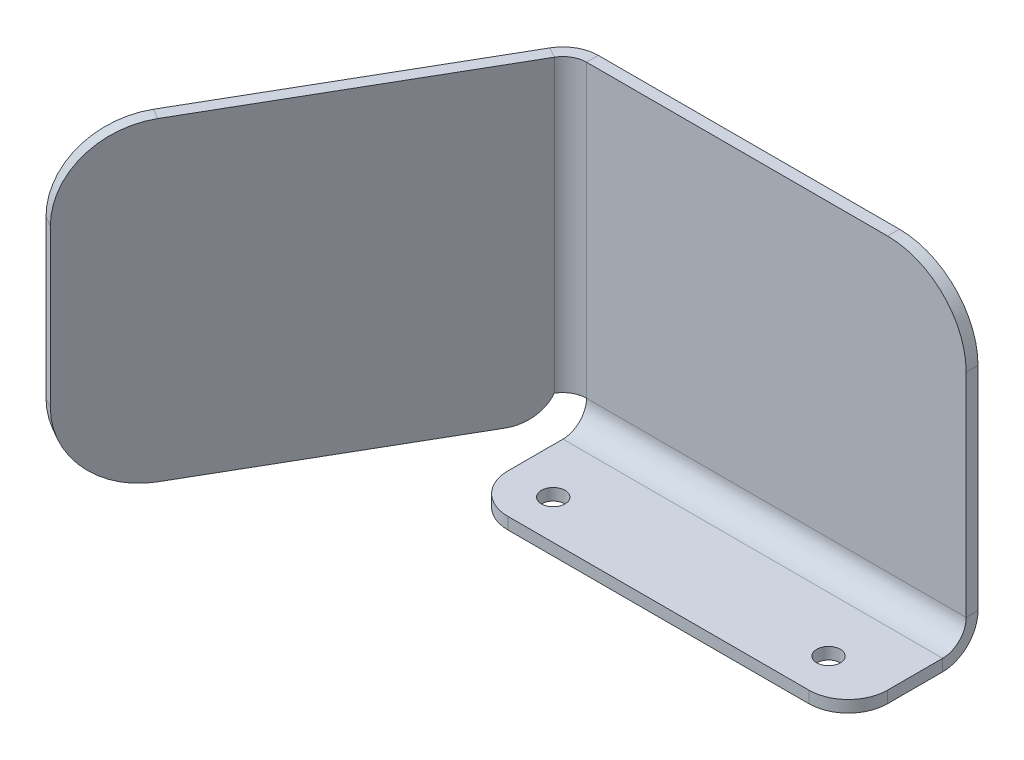
ISO-10303-21;
HEADER;
FILE_DESCRIPTION(('STEP AP214'),'2;1');
FILE_NAME('part.step','',(''),(''),'','','');
FILE_SCHEMA(('AUTOMOTIVE_DESIGN { 1 0 10303 214 1 1 1 1 }'));
ENDSEC;
DATA;
#1=APPLICATION_CONTEXT('core data for automotive mechanical design processes');
#2=APPLICATION_PROTOCOL_DEFINITION('international standard','automotive_design',2000,#1);
#3=PRODUCT_CONTEXT('',#1,'mechanical');
#4=PRODUCT('Part','Part','',(#3));
#5=PRODUCT_RELATED_PRODUCT_CATEGORY('part','',(#4));
#6=PRODUCT_DEFINITION_FORMATION('','',#4);
#7=PRODUCT_DEFINITION_CONTEXT('part definition',#1,'design');
#8=PRODUCT_DEFINITION('design','',#6,#7);
#9=PRODUCT_DEFINITION_SHAPE('','',#8);
#10=(LENGTH_UNIT() NAMED_UNIT(*) SI_UNIT(.MILLI.,.METRE.));
#11=(NAMED_UNIT(*) PLANE_ANGLE_UNIT() SI_UNIT($,.RADIAN.));
#12=(NAMED_UNIT(*) SI_UNIT($,.STERADIAN.) SOLID_ANGLE_UNIT());
#13=UNCERTAINTY_MEASURE_WITH_UNIT(LENGTH_MEASURE(1.E-05),#10,'distance_accuracy_value','');
#14=(GEOMETRIC_REPRESENTATION_CONTEXT(3) GLOBAL_UNCERTAINTY_ASSIGNED_CONTEXT((#13)) GLOBAL_UNIT_ASSIGNED_CONTEXT((#10,
#11,#12)) REPRESENTATION_CONTEXT('',''));
#15=CARTESIAN_POINT('',(0.,0.,0.));
#16=DIRECTION('',(0.,0.,1.));
#17=DIRECTION('',(1.,0.,0.));
#18=AXIS2_PLACEMENT_3D('',#15,#16,#17);
#19=CARTESIAN_POINT('',(-23.2679491924311,-20.,4.50000000000002));
#20=DIRECTION('',(0.,-1.,0.));
#21=DIRECTION('',(-0.866025403784436,0.,-0.500000000000004));
#22=AXIS2_PLACEMENT_3D('',#19,#20,#21);
#23=CYLINDRICAL_SURFACE('',#22,4.5);
#24=DIRECTION('',(0.,-1.,0.));
#25=VECTOR('',#24,1.);
#26=CARTESIAN_POINT('',(-23.2679491924311,-20.,0.));
#27=LINE('',#26,#25);
#28=CARTESIAN_POINT('',(-23.2679491924311,-17.,0.));
#29=VERTEX_POINT('',#28);
#30=CARTESIAN_POINT('',(-23.2679491924311,20.,0.));
#31=VERTEX_POINT('',#30);
#32=EDGE_CURVE('E250',#29,#31,#27,.F.);
#33=ORIENTED_EDGE('',*,*,#32,.F.);
#34=CARTESIAN_POINT('',(-23.2679491924311,-17.,4.50000000000002));
#35=DIRECTION('',(0.,-1.,0.));
#36=DIRECTION('',(0.,0.,-1.));
#37=AXIS2_PLACEMENT_3D('',#34,#35,#36);
#38=CIRCLE('',#37,4.5);
#39=CARTESIAN_POINT('',(-27.1650635094611,-17.,2.24999999999999));
#40=VERTEX_POINT('',#39);
#41=EDGE_CURVE('E277',#29,#40,#38,.F.);
#42=ORIENTED_EDGE('',*,*,#41,.T.);
#43=DIRECTION('',(0.,-1.,0.));
#44=VECTOR('',#43,1.);
#45=CARTESIAN_POINT('',(-27.1650635094611,0.,2.24999999999999));
#46=LINE('',#45,#44);
#47=CARTESIAN_POINT('',(-27.1650635094611,20.,2.24999999999998));
#48=VERTEX_POINT('',#47);
#49=EDGE_CURVE('E226',#48,#40,#46,.T.);
#50=ORIENTED_EDGE('',*,*,#49,.F.);
#51=CARTESIAN_POINT('',(-23.2679491924311,20.,4.5));
#52=DIRECTION('',(0.,-1.,0.));
#53=DIRECTION('',(0.,0.,-1.));
#54=AXIS2_PLACEMENT_3D('',#51,#52,#53);
#55=CIRCLE('',#54,4.5);
#56=EDGE_CURVE('E253',#31,#48,#55,.F.);
#57=ORIENTED_EDGE('',*,*,#56,.F.);
#58=EDGE_LOOP('',(#33,#42,#50,#57));
#59=FACE_BOUND('',#58,.T.);
#60=ADVANCED_FACE('F38',(#59),#23,.T.);
#61=CARTESIAN_POINT('',(-23.2679491924311,-17.,4.50000000000002));
#62=DIRECTION('',(0.,-1.,0.));
#63=DIRECTION('',(0.,0.,-1.));
#64=AXIS2_PLACEMENT_3D('',#61,#62,#63);
#65=PLANE('',#64);
#66=CARTESIAN_POINT('',(-23.2679491924311,-17.,4.50000000000002));
#67=DIRECTION('',(0.,-1.,0.));
#68=DIRECTION('',(0.,0.,-1.));
#69=AXIS2_PLACEMENT_3D('',#66,#67,#68);
#70=CIRCLE('',#69,3.);
#71=CARTESIAN_POINT('',(-23.2679491924311,-17.,1.50000000000002));
#72=VERTEX_POINT('',#71);
#73=CARTESIAN_POINT('',(-25.8660254037844,-17.,3.));
#74=VERTEX_POINT('',#73);
#75=EDGE_CURVE('E271',#72,#74,#70,.F.);
#76=ORIENTED_EDGE('',*,*,#75,.T.);
#77=DIRECTION('',(-0.866025403784436,0.,-0.500000000000004));
#78=VECTOR('',#77,1.);
#79=CARTESIAN_POINT('',(-25.8660254037844,-17.,3.));
#80=LINE('',#79,#78);
#81=EDGE_CURVE('E280',#74,#40,#80,.T.);
#82=ORIENTED_EDGE('',*,*,#81,.T.);
#83=ORIENTED_EDGE('',*,*,#41,.F.);
#84=DIRECTION('',(0.,0.,-1.));
#85=VECTOR('',#84,1.);
#86=CARTESIAN_POINT('',(-23.2679491924311,-17.,1.5));
#87=LINE('',#86,#85);
#88=EDGE_CURVE('E217',#72,#29,#87,.T.);
#89=ORIENTED_EDGE('',*,*,#88,.F.);
#90=EDGE_LOOP('',(#76,#82,#83,#89));
#91=FACE_BOUND('',#90,.T.);
#92=ADVANCED_FACE('F389',(#91),#65,.T.);
#93=CARTESIAN_POINT('',(0.,0.,1.5));
#94=DIRECTION('',(0.,0.,1.));
#95=DIRECTION('',(1.,0.,0.));
#96=AXIS2_PLACEMENT_3D('',#93,#94,#95);
#97=PLANE('',#96);
#98=DIRECTION('',(0.,1.,0.));
#99=VECTOR('',#98,1.);
#100=CARTESIAN_POINT('',(25.,20.,1.5));
#101=LINE('',#100,#99);
#102=CARTESIAN_POINT('',(25.,-17.,1.5));
#103=VERTEX_POINT('',#102);
#104=CARTESIAN_POINT('',(25.,9.99999999999999,1.5));
#105=VERTEX_POINT('',#104);
#106=EDGE_CURVE('E265',#103,#105,#101,.T.);
#107=ORIENTED_EDGE('',*,*,#106,.T.);
#108=CARTESIAN_POINT('',(15.,9.99999999999999,1.5));
#109=DIRECTION('',(0.,0.,1.));
#110=DIRECTION('',(1.,0.,0.));
#111=AXIS2_PLACEMENT_3D('',#108,#109,#110);
#112=CIRCLE('',#111,10.);
#113=CARTESIAN_POINT('',(15.,20.,1.5));
#114=VERTEX_POINT('',#113);
#115=EDGE_CURVE('E290',#105,#114,#112,.T.);
#116=ORIENTED_EDGE('',*,*,#115,.T.);
#117=DIRECTION('',(-1.,0.,0.));
#118=VECTOR('',#117,1.);
#119=CARTESIAN_POINT('',(-25.,20.,1.5));
#120=LINE('',#119,#118);
#121=CARTESIAN_POINT('',(-23.2679491924311,20.,1.5));
#122=VERTEX_POINT('',#121);
#123=EDGE_CURVE('E268',#114,#122,#120,.T.);
#124=ORIENTED_EDGE('',*,*,#123,.T.);
#125=DIRECTION('',(0.,-1.,0.));
#126=VECTOR('',#125,1.);
#127=CARTESIAN_POINT('',(-23.2679491924311,-20.,1.50000000000002));
#128=LINE('',#127,#126);
#129=EDGE_CURVE('E242',#72,#122,#128,.F.);
#130=ORIENTED_EDGE('',*,*,#129,.F.);
#131=DIRECTION('',(1.,0.,0.));
#132=VECTOR('',#131,1.);
#133=CARTESIAN_POINT('',(25.,-17.,1.5));
#134=LINE('',#133,#132);
#135=EDGE_CURVE('E213',#103,#72,#134,.F.);
#136=ORIENTED_EDGE('',*,*,#135,.F.);
#137=EDGE_LOOP('',(#107,#116,#124,#130,#136));
#138=FACE_BOUND('',#137,.T.);
#139=ADVANCED_FACE('F395',(#138),#97,.T.);
#140=CARTESIAN_POINT('',(0.,0.,0.));
#141=DIRECTION('',(0.,0.,1.));
#142=DIRECTION('',(1.,0.,0.));
#143=AXIS2_PLACEMENT_3D('',#140,#141,#142);
#144=PLANE('',#143);
#145=DIRECTION('',(-1.,0.,0.));
#146=VECTOR('',#145,1.);
#147=CARTESIAN_POINT('',(-25.,20.,0.));
#148=LINE('',#147,#146);
#149=CARTESIAN_POINT('',(15.,20.,0.));
#150=VERTEX_POINT('',#149);
#151=EDGE_CURVE('E269',#150,#31,#148,.T.);
#152=ORIENTED_EDGE('',*,*,#151,.F.);
#153=CARTESIAN_POINT('',(15.,9.99999999999999,0.));
#154=DIRECTION('',(0.,0.,1.));
#155=DIRECTION('',(1.,0.,0.));
#156=AXIS2_PLACEMENT_3D('',#153,#154,#155);
#157=CIRCLE('',#156,10.);
#158=CARTESIAN_POINT('',(25.,9.99999999999999,0.));
#159=VERTEX_POINT('',#158);
#160=EDGE_CURVE('E286',#150,#159,#157,.F.);
#161=ORIENTED_EDGE('',*,*,#160,.T.);
#162=DIRECTION('',(0.,1.,0.));
#163=VECTOR('',#162,1.);
#164=CARTESIAN_POINT('',(25.,20.,0.));
#165=LINE('',#164,#163);
#166=CARTESIAN_POINT('',(25.,-17.,0.));
#167=VERTEX_POINT('',#166);
#168=EDGE_CURVE('E264',#167,#159,#165,.T.);
#169=ORIENTED_EDGE('',*,*,#168,.F.);
#170=DIRECTION('',(1.,0.,0.));
#171=VECTOR('',#170,1.);
#172=CARTESIAN_POINT('',(25.,-17.,0.));
#173=LINE('',#172,#171);
#174=EDGE_CURVE('E179',#167,#29,#173,.F.);
#175=ORIENTED_EDGE('',*,*,#174,.T.);
#176=ORIENTED_EDGE('',*,*,#32,.T.);
#177=EDGE_LOOP('',(#152,#161,#169,#175,#176));
#178=FACE_BOUND('',#177,.T.);
#179=ADVANCED_FACE('F415',(#178),#144,.F.);
#180=CARTESIAN_POINT('',(25.,20.,1.5));
#181=DIRECTION('',(-1.,0.,0.));
#182=DIRECTION('',(0.,-1.,0.));
#183=AXIS2_PLACEMENT_3D('',#180,#181,#182);
#184=PLANE('',#183);
#185=ORIENTED_EDGE('',*,*,#168,.T.);
#186=DIRECTION('',(0.,0.,-1.));
#187=VECTOR('',#186,1.);
#188=CARTESIAN_POINT('',(25.,9.99999999999999,1.5));
#189=LINE('',#188,#187);
#190=EDGE_CURVE('E288',#159,#105,#189,.F.);
#191=ORIENTED_EDGE('',*,*,#190,.T.);
#192=ORIENTED_EDGE('',*,*,#106,.F.);
#193=DIRECTION('',(0.,0.,-1.));
#194=VECTOR('',#193,1.);
#195=CARTESIAN_POINT('',(25.,-17.,1.5));
#196=LINE('',#195,#194);
#197=EDGE_CURVE('E209',#103,#167,#196,.T.);
#198=ORIENTED_EDGE('',*,*,#197,.T.);
#199=EDGE_LOOP('',(#185,#191,#192,#198));
#200=FACE_BOUND('',#199,.T.);
#201=ADVANCED_FACE('F419',(#200),#184,.F.);
#202=CARTESIAN_POINT('',(-25.,20.,1.5));
#203=DIRECTION('',(0.,-1.,0.));
#204=DIRECTION('',(0.,0.,-1.));
#205=AXIS2_PLACEMENT_3D('',#202,#203,#204);
#206=PLANE('',#205);
#207=ORIENTED_EDGE('',*,*,#123,.F.);
#208=DIRECTION('',(0.,0.,-1.));
#209=VECTOR('',#208,1.);
#210=CARTESIAN_POINT('',(15.,20.,1.5));
#211=LINE('',#210,#209);
#212=EDGE_CURVE('E283',#114,#150,#211,.T.);
#213=ORIENTED_EDGE('',*,*,#212,.T.);
#214=ORIENTED_EDGE('',*,*,#151,.T.);
#215=DIRECTION('',(0.,0.,-1.));
#216=VECTOR('',#215,1.);
#217=CARTESIAN_POINT('',(-23.2679491924311,20.,1.5));
#218=LINE('',#217,#216);
#219=EDGE_CURVE('E257',#122,#31,#218,.T.);
#220=ORIENTED_EDGE('',*,*,#219,.F.);
#221=EDGE_LOOP('',(#207,#213,#214,#220));
#222=FACE_BOUND('',#221,.T.);
#223=ADVANCED_FACE('F411',(#222),#206,.F.);
#224=CARTESIAN_POINT('',(-23.2679491924311,20.,4.5));
#225=DIRECTION('',(0.,1.,0.));
#226=DIRECTION('',(0.,0.,1.));
#227=AXIS2_PLACEMENT_3D('',#224,#225,#226);
#228=PLANE('',#227);
#229=DIRECTION('',(-0.866025403784436,0.,-0.500000000000004));
#230=VECTOR('',#229,1.);
#231=CARTESIAN_POINT('',(-25.8660254037844,20.,2.99999999999999));
#232=LINE('',#231,#230);
#233=CARTESIAN_POINT('',(-25.8660254037844,20.,2.99999999999998));
#234=VERTEX_POINT('',#233);
#235=EDGE_CURVE('E220',#234,#48,#232,.T.);
#236=ORIENTED_EDGE('',*,*,#235,.F.);
#237=CARTESIAN_POINT('',(-23.2679491924311,20.,4.5));
#238=DIRECTION('',(0.,-1.,0.));
#239=DIRECTION('',(0.,0.,-1.));
#240=AXIS2_PLACEMENT_3D('',#237,#238,#239);
#241=CIRCLE('',#240,3.);
#242=EDGE_CURVE('E254',#122,#234,#241,.F.);
#243=ORIENTED_EDGE('',*,*,#242,.F.);
#244=ORIENTED_EDGE('',*,*,#219,.T.);
#245=ORIENTED_EDGE('',*,*,#56,.T.);
#246=EDGE_LOOP('',(#236,#243,#244,#245));
#247=FACE_BOUND('',#246,.T.);
#248=ADVANCED_FACE('F407',(#247),#228,.T.);
#249=CARTESIAN_POINT('',(-23.2679491924311,-20.,4.50000000000002));
#250=DIRECTION('',(0.,-1.,0.));
#251=DIRECTION('',(-0.866025403784436,0.,-0.500000000000004));
#252=AXIS2_PLACEMENT_3D('',#249,#250,#251);
#253=CYLINDRICAL_SURFACE('',#252,3.);
#254=ORIENTED_EDGE('',*,*,#75,.F.);
#255=ORIENTED_EDGE('',*,*,#129,.T.);
#256=ORIENTED_EDGE('',*,*,#242,.T.);
#257=DIRECTION('',(0.,-1.,0.));
#258=VECTOR('',#257,1.);
#259=CARTESIAN_POINT('',(-25.8660254037844,20.,2.99999999999999));
#260=LINE('',#259,#258);
#261=EDGE_CURVE('E223',#234,#74,#260,.T.);
#262=ORIENTED_EDGE('',*,*,#261,.T.);
#263=EDGE_LOOP('',(#254,#255,#256,#262));
#264=FACE_BOUND('',#263,.T.);
#265=ADVANCED_FACE('F403',(#264),#253,.F.);
#266=CARTESIAN_POINT('',(-26.2990381056766,-20.,0.749999999999995));
#267=DIRECTION('',(0.,-1.,0.));
#268=DIRECTION('',(1.,0.,0.));
#269=AXIS2_PLACEMENT_3D('',#266,#267,#268);
#270=PLANE('',#269);
#271=DIRECTION('',(0.500000000000004,0.,-0.866025403784436));
#272=VECTOR('',#271,1.);
#273=CARTESIAN_POINT('',(-26.2990381056766,-20.,0.749999999999995));
#274=LINE('',#273,#272);
#275=CARTESIAN_POINT('',(-45.6160254037846,-20.,34.2080034494852));
#276=VERTEX_POINT('',#275);
#277=CARTESIAN_POINT('',(-29.456351356939,-20.,6.21862696659684));
#278=VERTEX_POINT('',#277);
#279=EDGE_CURVE('E239',#276,#278,#274,.T.);
#280=ORIENTED_EDGE('',*,*,#279,.T.);
#281=DIRECTION('',(-0.866025403784436,0.,-0.500000000000004));
#282=VECTOR('',#281,1.);
#283=CARTESIAN_POINT('',(-28.1573132512623,-20.,6.96862696659686));
#284=LINE('',#283,#282);
#285=CARTESIAN_POINT('',(-28.1573132512624,-20.,6.96862696659685));
#286=VERTEX_POINT('',#285);
#287=EDGE_CURVE('E312',#278,#286,#284,.F.);
#288=ORIENTED_EDGE('',*,*,#287,.T.);
#289=DIRECTION('',(0.500000000000004,0.,-0.866025403784436));
#290=VECTOR('',#289,1.);
#291=CARTESIAN_POINT('',(-25.,-20.,1.5));
#292=LINE('',#291,#290);
#293=CARTESIAN_POINT('',(-44.3169872981079,-20.,34.9580034494852));
#294=VERTEX_POINT('',#293);
#295=EDGE_CURVE('E236',#294,#286,#292,.T.);
#296=ORIENTED_EDGE('',*,*,#295,.F.);
#297=DIRECTION('',(0.866025403784436,0.,0.500000000000004));
#298=VECTOR('',#297,1.);
#299=CARTESIAN_POINT('',(-45.6160254037846,-20.,34.2080034494852));
#300=LINE('',#299,#298);
#301=EDGE_CURVE('E301',#294,#276,#300,.F.);
#302=ORIENTED_EDGE('',*,*,#301,.T.);
#303=EDGE_LOOP('',(#280,#288,#296,#302));
#304=FACE_BOUND('',#303,.T.);
#305=ADVANCED_FACE('F406',(#304),#270,.T.);
#306=CARTESIAN_POINT('',(-50.6160254037846,20.,42.8682574873296));
#307=DIRECTION('',(0.,1.,0.));
#308=DIRECTION('',(-1.,0.,0.));
#309=AXIS2_PLACEMENT_3D('',#306,#307,#308);
#310=PLANE('',#309);
#311=DIRECTION('',(-0.500000000000004,0.,0.866025403784436));
#312=VECTOR('',#311,1.);
#313=CARTESIAN_POINT('',(-50.6160254037846,20.,42.8682574873296));
#314=LINE('',#313,#312);
#315=CARTESIAN_POINT('',(-45.6160254037846,20.,34.2080034494852));
#316=VERTEX_POINT('',#315);
#317=EDGE_CURVE('E232',#48,#316,#314,.T.);
#318=ORIENTED_EDGE('',*,*,#317,.T.);
#319=DIRECTION('',(0.866025403784436,0.,0.500000000000004));
#320=VECTOR('',#319,1.);
#321=CARTESIAN_POINT('',(-45.6160254037846,20.,34.2080034494852));
#322=LINE('',#321,#320);
#323=CARTESIAN_POINT('',(-44.3169872981079,20.,34.9580034494852));
#324=VERTEX_POINT('',#323);
#325=EDGE_CURVE('E307',#316,#324,#322,.T.);
#326=ORIENTED_EDGE('',*,*,#325,.T.);
#327=DIRECTION('',(-0.500000000000004,0.,0.866025403784436));
#328=VECTOR('',#327,1.);
#329=CARTESIAN_POINT('',(-49.316987298108,20.,43.6182574873296));
#330=LINE('',#329,#328);
#331=EDGE_CURVE('E231',#234,#324,#330,.T.);
#332=ORIENTED_EDGE('',*,*,#331,.F.);
#333=ORIENTED_EDGE('',*,*,#235,.T.);
#334=EDGE_LOOP('',(#318,#326,#332,#333));
#335=FACE_BOUND('',#334,.T.);
#336=ADVANCED_FACE('F401',(#335),#310,.T.);
#337=CARTESIAN_POINT('',(-19.3995190528382,0.,-11.2003175473055));
#338=DIRECTION('',(-0.866025403784436,0.,-0.500000000000004));
#339=DIRECTION('',(-0.500000000000004,0.,0.866025403784436));
#340=AXIS2_PLACEMENT_3D('',#337,#338,#339);
#341=PLANE('',#340);
#342=ORIENTED_EDGE('',*,*,#49,.T.);
#343=CARTESIAN_POINT('',(-29.456351356939,-14.9999999999999,6.21862696659684));
#344=DIRECTION('',(-0.866025403784436,0.,-0.500000000000004));
#345=DIRECTION('',(-0.500000000000004,0.,0.866025403784436));
#346=AXIS2_PLACEMENT_3D('',#343,#344,#345);
#347=CIRCLE('',#346,5.);
#348=EDGE_CURVE('E310',#40,#278,#347,.T.);
#349=ORIENTED_EDGE('',*,*,#348,.T.);
#350=ORIENTED_EDGE('',*,*,#279,.F.);
#351=CARTESIAN_POINT('',(-45.6160254037846,-10.,34.2080034494852));
#352=DIRECTION('',(-0.866025403784436,0.,-0.500000000000004));
#353=DIRECTION('',(-0.500000000000004,0.,0.866025403784436));
#354=AXIS2_PLACEMENT_3D('',#351,#352,#353);
#355=CIRCLE('',#354,10.);
#356=CARTESIAN_POINT('',(-50.6160254037846,-10.,42.8682574873296));
#357=VERTEX_POINT('',#356);
#358=EDGE_CURVE('E305',#276,#357,#355,.T.);
#359=ORIENTED_EDGE('',*,*,#358,.T.);
#360=DIRECTION('',(0.,-1.,0.));
#361=VECTOR('',#360,1.);
#362=CARTESIAN_POINT('',(-50.6160254037846,-20.,42.8682574873296));
#363=LINE('',#362,#361);
#364=CARTESIAN_POINT('',(-50.6160254037846,9.99999999999998,42.8682574873296));
#365=VERTEX_POINT('',#364);
#366=EDGE_CURVE('E235',#365,#357,#363,.T.);
#367=ORIENTED_EDGE('',*,*,#366,.F.);
#368=CARTESIAN_POINT('',(-45.6160254037846,9.99999999999998,34.2080034494852));
#369=DIRECTION('',(-0.866025403784436,0.,-0.500000000000004));
#370=DIRECTION('',(-0.500000000000004,0.,0.866025403784436));
#371=AXIS2_PLACEMENT_3D('',#368,#369,#370);
#372=CIRCLE('',#371,10.);
#373=EDGE_CURVE('E303',#365,#316,#372,.T.);
#374=ORIENTED_EDGE('',*,*,#373,.T.);
#375=ORIENTED_EDGE('',*,*,#317,.F.);
#376=EDGE_LOOP('',(#342,#349,#350,#359,#367,#374,#375));
#377=FACE_BOUND('',#376,.T.);
#378=ADVANCED_FACE('F512',(#377),#341,.T.);
#379=CARTESIAN_POINT('',(-18.1004809471616,0.,-10.4503175473055));
#380=DIRECTION('',(-0.866025403784436,0.,-0.500000000000004));
#381=DIRECTION('',(-0.500000000000004,0.,0.866025403784436));
#382=AXIS2_PLACEMENT_3D('',#379,#380,#381);
#383=PLANE('',#382);
#384=ORIENTED_EDGE('',*,*,#295,.T.);
#385=CARTESIAN_POINT('',(-28.1573132512624,-14.9999999999999,6.96862696659685));
#386=DIRECTION('',(-0.866025403784436,0.,-0.500000000000004));
#387=DIRECTION('',(-0.500000000000004,0.,0.866025403784436));
#388=AXIS2_PLACEMENT_3D('',#385,#386,#387);
#389=CIRCLE('',#388,5.);
#390=EDGE_CURVE('E314',#286,#74,#389,.F.);
#391=ORIENTED_EDGE('',*,*,#390,.T.);
#392=ORIENTED_EDGE('',*,*,#261,.F.);
#393=ORIENTED_EDGE('',*,*,#331,.T.);
#394=CARTESIAN_POINT('',(-44.3169872981079,9.99999999999998,34.9580034494852));
#395=DIRECTION('',(-0.866025403784436,0.,-0.500000000000004));
#396=DIRECTION('',(-0.500000000000004,0.,0.866025403784436));
#397=AXIS2_PLACEMENT_3D('',#394,#395,#396);
#398=CIRCLE('',#397,10.);
#399=CARTESIAN_POINT('',(-49.316987298108,9.99999999999998,43.6182574873296));
#400=VERTEX_POINT('',#399);
#401=EDGE_CURVE('E297',#324,#400,#398,.F.);
#402=ORIENTED_EDGE('',*,*,#401,.T.);
#403=DIRECTION('',(0.,-1.,0.));
#404=VECTOR('',#403,1.);
#405=CARTESIAN_POINT('',(-49.316987298108,-20.,43.6182574873296));
#406=LINE('',#405,#404);
#407=CARTESIAN_POINT('',(-49.316987298108,-10.,43.6182574873296));
#408=VERTEX_POINT('',#407);
#409=EDGE_CURVE('E245',#400,#408,#406,.T.);
#410=ORIENTED_EDGE('',*,*,#409,.T.);
#411=CARTESIAN_POINT('',(-44.3169872981079,-10.,34.9580034494852));
#412=DIRECTION('',(-0.866025403784436,0.,-0.500000000000004));
#413=DIRECTION('',(-0.500000000000004,0.,0.866025403784436));
#414=AXIS2_PLACEMENT_3D('',#411,#412,#413);
#415=CIRCLE('',#414,10.);
#416=EDGE_CURVE('E299',#408,#294,#415,.F.);
#417=ORIENTED_EDGE('',*,*,#416,.T.);
#418=EDGE_LOOP('',(#384,#391,#392,#393,#402,#410,#417));
#419=FACE_BOUND('',#418,.T.);
#420=ADVANCED_FACE('F506',(#419),#383,.F.);
#421=CARTESIAN_POINT('',(-50.6160254037846,-20.,42.8682574873296));
#422=DIRECTION('',(-0.500000000000004,0.,0.866025403784436));
#423=DIRECTION('',(0.866025403784436,0.,0.500000000000004));
#424=AXIS2_PLACEMENT_3D('',#421,#422,#423);
#425=PLANE('',#424);
#426=ORIENTED_EDGE('',*,*,#366,.T.);
#427=DIRECTION('',(0.866025403784436,0.,0.500000000000004));
#428=VECTOR('',#427,1.);
#429=CARTESIAN_POINT('',(-50.6160254037846,-10.,42.8682574873296));
#430=LINE('',#429,#428);
#431=EDGE_CURVE('E294',#357,#408,#430,.T.);
#432=ORIENTED_EDGE('',*,*,#431,.T.);
#433=ORIENTED_EDGE('',*,*,#409,.F.);
#434=DIRECTION('',(0.866025403784436,0.,0.500000000000004));
#435=VECTOR('',#434,1.);
#436=CARTESIAN_POINT('',(-50.6160254037846,9.99999999999998,42.8682574873296));
#437=LINE('',#436,#435);
#438=EDGE_CURVE('E292',#400,#365,#437,.F.);
#439=ORIENTED_EDGE('',*,*,#438,.T.);
#440=EDGE_LOOP('',(#426,#432,#433,#439));
#441=FACE_BOUND('',#440,.T.);
#442=ADVANCED_FACE('F511',(#441),#425,.T.);
#443=CARTESIAN_POINT('',(-23.2679491924311,-17.,4.5));
#444=DIRECTION('',(-1.,0.,0.));
#445=DIRECTION('',(0.,0.,1.));
#446=AXIS2_PLACEMENT_3D('',#443,#444,#445);
#447=PLANE('',#446);
#448=DIRECTION('',(0.,-1.,0.));
#449=VECTOR('',#448,1.);
#450=CARTESIAN_POINT('',(-23.2679491924311,-20.,4.49999999999999));
#451=LINE('',#450,#449);
#452=CARTESIAN_POINT('',(-23.2679491924311,-20.,4.49999999999999));
#453=VERTEX_POINT('',#452);
#454=CARTESIAN_POINT('',(-23.2679491924311,-21.5,4.49999999999998));
#455=VERTEX_POINT('',#454);
#456=EDGE_CURVE('E200',#453,#455,#451,.T.);
#457=ORIENTED_EDGE('',*,*,#456,.F.);
#458=CARTESIAN_POINT('',(-23.2679491924311,-17.,4.5));
#459=DIRECTION('',(1.,0.,0.));
#460=DIRECTION('',(0.,0.,-1.));
#461=AXIS2_PLACEMENT_3D('',#458,#459,#460);
#462=CIRCLE('',#461,3.);
#463=EDGE_CURVE('E182',#72,#453,#462,.F.);
#464=ORIENTED_EDGE('',*,*,#463,.F.);
#465=ORIENTED_EDGE('',*,*,#88,.T.);
#466=CARTESIAN_POINT('',(-23.2679491924311,-17.,4.5));
#467=DIRECTION('',(1.,0.,0.));
#468=DIRECTION('',(0.,0.,-1.));
#469=AXIS2_PLACEMENT_3D('',#466,#467,#468);
#470=CIRCLE('',#469,4.5);
#471=EDGE_CURVE('E208',#29,#455,#470,.F.);
#472=ORIENTED_EDGE('',*,*,#471,.T.);
#473=EDGE_LOOP('',(#457,#464,#465,#472));
#474=FACE_BOUND('',#473,.T.);
#475=ADVANCED_FACE('F583',(#474),#447,.T.);
#476=CARTESIAN_POINT('',(25.,-17.,4.5));
#477=DIRECTION('',(-1.,0.,0.));
#478=DIRECTION('',(0.,0.,1.));
#479=AXIS2_PLACEMENT_3D('',#476,#477,#478);
#480=PLANE('',#479);
#481=CARTESIAN_POINT('',(25.,-17.,4.5));
#482=DIRECTION('',(1.,0.,0.));
#483=DIRECTION('',(0.,0.,-1.));
#484=AXIS2_PLACEMENT_3D('',#481,#482,#483);
#485=CIRCLE('',#484,3.);
#486=CARTESIAN_POINT('',(25.,-20.,4.49999999999999));
#487=VERTEX_POINT('',#486);
#488=EDGE_CURVE('E167',#487,#103,#485,.T.);
#489=ORIENTED_EDGE('',*,*,#488,.F.);
#490=DIRECTION('',(0.,-1.,0.));
#491=VECTOR('',#490,1.);
#492=CARTESIAN_POINT('',(25.,-20.,4.49999999999999));
#493=LINE('',#492,#491);
#494=CARTESIAN_POINT('',(25.,-21.5,4.49999999999998));
#495=VERTEX_POINT('',#494);
#496=EDGE_CURVE('E165',#487,#495,#493,.T.);
#497=ORIENTED_EDGE('',*,*,#496,.T.);
#498=CARTESIAN_POINT('',(25.,-17.,4.5));
#499=DIRECTION('',(1.,0.,0.));
#500=DIRECTION('',(0.,0.,-1.));
#501=AXIS2_PLACEMENT_3D('',#498,#499,#500);
#502=CIRCLE('',#501,4.5);
#503=EDGE_CURVE('E173',#495,#167,#502,.T.);
#504=ORIENTED_EDGE('',*,*,#503,.T.);
#505=ORIENTED_EDGE('',*,*,#197,.F.);
#506=EDGE_LOOP('',(#489,#497,#504,#505));
#507=FACE_BOUND('',#506,.T.);
#508=ADVANCED_FACE('F185',(#507),#480,.F.);
#509=CARTESIAN_POINT('',(25.,-17.,4.5));
#510=DIRECTION('',(1.,0.,0.));
#511=DIRECTION('',(0.,-1.,0.));
#512=AXIS2_PLACEMENT_3D('',#509,#510,#511);
#513=CYLINDRICAL_SURFACE('',#512,4.5);
#514=ORIENTED_EDGE('',*,*,#174,.F.);
#515=ORIENTED_EDGE('',*,*,#503,.F.);
#516=DIRECTION('',(1.,0.,0.));
#517=VECTOR('',#516,1.);
#518=CARTESIAN_POINT('',(0.,-21.5,4.49999999999998));
#519=LINE('',#518,#517);
#520=EDGE_CURVE('E176',#455,#495,#519,.T.);
#521=ORIENTED_EDGE('',*,*,#520,.F.);
#522=ORIENTED_EDGE('',*,*,#471,.F.);
#523=EDGE_LOOP('',(#514,#515,#521,#522));
#524=FACE_BOUND('',#523,.T.);
#525=ADVANCED_FACE('F174',(#524),#513,.T.);
#526=CARTESIAN_POINT('',(25.,-17.,4.5));
#527=DIRECTION('',(1.,0.,0.));
#528=DIRECTION('',(0.,-1.,0.));
#529=AXIS2_PLACEMENT_3D('',#526,#527,#528);
#530=CYLINDRICAL_SURFACE('',#529,3.);
#531=ORIENTED_EDGE('',*,*,#135,.T.);
#532=ORIENTED_EDGE('',*,*,#463,.T.);
#533=DIRECTION('',(1.,0.,0.));
#534=VECTOR('',#533,1.);
#535=CARTESIAN_POINT('',(-23.2679491924311,-20.,4.49999999999999));
#536=LINE('',#535,#534);
#537=EDGE_CURVE('E187',#453,#487,#536,.T.);
#538=ORIENTED_EDGE('',*,*,#537,.T.);
#539=ORIENTED_EDGE('',*,*,#488,.T.);
#540=EDGE_LOOP('',(#531,#532,#538,#539));
#541=FACE_BOUND('',#540,.T.);
#542=ADVANCED_FACE('F347',(#541),#530,.F.);
#543=CARTESIAN_POINT('',(25.,-21.5,1.49999999999999));
#544=DIRECTION('',(1.,0.,0.));
#545=DIRECTION('',(0.,0.,-1.));
#546=AXIS2_PLACEMENT_3D('',#543,#544,#545);
#547=PLANE('',#546);
#548=DIRECTION('',(0.,0.,-1.));
#549=VECTOR('',#548,1.);
#550=CARTESIAN_POINT('',(25.,-20.,1.5));
#551=LINE('',#550,#549);
#552=CARTESIAN_POINT('',(25.,-20.,11.5));
#553=VERTEX_POINT('',#552);
#554=EDGE_CURVE('E202',#553,#487,#551,.T.);
#555=ORIENTED_EDGE('',*,*,#554,.F.);
#556=DIRECTION('',(0.,1.,0.));
#557=VECTOR('',#556,1.);
#558=CARTESIAN_POINT('',(25.,-21.5,11.5));
#559=LINE('',#558,#557);
#560=CARTESIAN_POINT('',(25.,-21.5,11.5));
#561=VERTEX_POINT('',#560);
#562=EDGE_CURVE('E12',#553,#561,#559,.F.);
#563=ORIENTED_EDGE('',*,*,#562,.T.);
#564=DIRECTION('',(0.,0.,-1.));
#565=VECTOR('',#564,1.);
#566=CARTESIAN_POINT('',(25.,-21.5,1.49999999999999));
#567=LINE('',#566,#565);
#568=EDGE_CURVE('E161',#561,#495,#567,.T.);
#569=ORIENTED_EDGE('',*,*,#568,.T.);
#570=ORIENTED_EDGE('',*,*,#496,.F.);
#571=EDGE_LOOP('',(#555,#563,#569,#570));
#572=FACE_BOUND('',#571,.T.);
#573=ADVANCED_FACE('F163',(#572),#547,.T.);
#574=CARTESIAN_POINT('',(-23.2679491924311,-21.5000000000001,16.5));
#575=DIRECTION('',(-1.,0.,0.));
#576=DIRECTION('',(0.,0.,1.));
#577=AXIS2_PLACEMENT_3D('',#574,#575,#576);
#578=PLANE('',#577);
#579=DIRECTION('',(0.,0.,1.));
#580=VECTOR('',#579,1.);
#581=CARTESIAN_POINT('',(-23.2679491924311,-21.5000000000001,16.5));
#582=LINE('',#581,#580);
#583=CARTESIAN_POINT('',(-23.2679491924311,-21.5,11.5));
#584=VERTEX_POINT('',#583);
#585=EDGE_CURVE('E192',#455,#584,#582,.T.);
#586=ORIENTED_EDGE('',*,*,#585,.T.);
#587=DIRECTION('',(0.,1.,0.));
#588=VECTOR('',#587,1.);
#589=CARTESIAN_POINT('',(-23.2679491924311,-21.5,11.5));
#590=LINE('',#589,#588);
#591=CARTESIAN_POINT('',(-23.2679491924311,-20.,11.5));
#592=VERTEX_POINT('',#591);
#593=EDGE_CURVE('E316',#584,#592,#590,.T.);
#594=ORIENTED_EDGE('',*,*,#593,.T.);
#595=DIRECTION('',(0.,0.,1.));
#596=VECTOR('',#595,1.);
#597=CARTESIAN_POINT('',(-23.2679491924311,-20.0000000000001,16.5));
#598=LINE('',#597,#596);
#599=EDGE_CURVE('E193',#453,#592,#598,.T.);
#600=ORIENTED_EDGE('',*,*,#599,.F.);
#601=ORIENTED_EDGE('',*,*,#456,.T.);
#602=EDGE_LOOP('',(#586,#594,#600,#601));
#603=FACE_BOUND('',#602,.T.);
#604=ADVANCED_FACE('F334',(#603),#578,.T.);
#605=CARTESIAN_POINT('',(0.,-21.5,0.));
#606=DIRECTION('',(0.,-1.,0.));
#607=DIRECTION('',(0.,0.,-1.));
#608=AXIS2_PLACEMENT_3D('',#605,#606,#607);
#609=PLANE('',#608);
#610=CARTESIAN_POINT('',(-17.5,-21.5,11.5));
#611=DIRECTION('',(0.,1.,0.));
#612=DIRECTION('',(0.,0.,1.));
#613=AXIS2_PLACEMENT_3D('',#610,#611,#612);
#614=CIRCLE('',#613,1.5);
#615=CARTESIAN_POINT('',(-17.5,-21.5,13.));
#616=VERTEX_POINT('',#615);
#617=EDGE_CURVE('E350',#616,#616,#614,.T.);
#618=ORIENTED_EDGE('',*,*,#617,.T.);
#619=EDGE_LOOP('',(#618));
#620=FACE_BOUND('',#619,.T.);
#621=CARTESIAN_POINT('',(17.5,-21.5,11.5));
#622=DIRECTION('',(0.,1.,0.));
#623=DIRECTION('',(0.,0.,1.));
#624=AXIS2_PLACEMENT_3D('',#621,#622,#623);
#625=CIRCLE('',#624,1.5);
#626=CARTESIAN_POINT('',(17.5,-21.5,13.));
#627=VERTEX_POINT('',#626);
#628=EDGE_CURVE('E355',#627,#627,#625,.T.);
#629=ORIENTED_EDGE('',*,*,#628,.T.);
#630=EDGE_LOOP('',(#629));
#631=FACE_BOUND('',#630,.T.);
#632=DIRECTION('',(1.,0.,0.));
#633=VECTOR('',#632,1.);
#634=CARTESIAN_POINT('',(25.,-21.5000000000001,16.5));
#635=LINE('',#634,#633);
#636=CARTESIAN_POINT('',(-18.2679491924311,-21.5000000000001,16.5));
#637=VERTEX_POINT('',#636);
#638=CARTESIAN_POINT('',(20.,-21.5000000000001,16.5));
#639=VERTEX_POINT('',#638);
#640=EDGE_CURVE('E168',#637,#639,#635,.T.);
#641=ORIENTED_EDGE('',*,*,#640,.F.);
#642=CARTESIAN_POINT('',(-18.2679491924311,-21.5,11.5));
#643=DIRECTION('',(0.,-1.,0.));
#644=DIRECTION('',(0.,0.,-1.));
#645=AXIS2_PLACEMENT_3D('',#642,#643,#644);
#646=CIRCLE('',#645,5.);
#647=EDGE_CURVE('E46',#637,#584,#646,.T.);
#648=ORIENTED_EDGE('',*,*,#647,.T.);
#649=ORIENTED_EDGE('',*,*,#585,.F.);
#650=ORIENTED_EDGE('',*,*,#520,.T.);
#651=ORIENTED_EDGE('',*,*,#568,.F.);
#652=CARTESIAN_POINT('',(20.,-21.5,11.5));
#653=DIRECTION('',(0.,-1.,0.));
#654=DIRECTION('',(0.,0.,-1.));
#655=AXIS2_PLACEMENT_3D('',#652,#653,#654);
#656=CIRCLE('',#655,5.);
#657=EDGE_CURVE('E58',#561,#639,#656,.T.);
#658=ORIENTED_EDGE('',*,*,#657,.T.);
#659=EDGE_LOOP('',(#641,#648,#649,#650,#651,#658));
#660=FACE_BOUND('',#659,.T.);
#661=ADVANCED_FACE('F190',(#620,#631,#660),#609,.T.);
#662=CARTESIAN_POINT('',(0.,-20.,0.));
#663=DIRECTION('',(0.,-1.,0.));
#664=DIRECTION('',(0.,0.,-1.));
#665=AXIS2_PLACEMENT_3D('',#662,#663,#664);
#666=PLANE('',#665);
#667=CARTESIAN_POINT('',(-17.5,-20.,11.5));
#668=DIRECTION('',(0.,1.,0.));
#669=DIRECTION('',(0.,0.,1.));
#670=AXIS2_PLACEMENT_3D('',#667,#668,#669);
#671=CIRCLE('',#670,1.5);
#672=CARTESIAN_POINT('',(-17.5,-20.,13.));
#673=VERTEX_POINT('',#672);
#674=EDGE_CURVE('E358',#673,#673,#671,.T.);
#675=ORIENTED_EDGE('',*,*,#674,.F.);
#676=EDGE_LOOP('',(#675));
#677=FACE_BOUND('',#676,.T.);
#678=CARTESIAN_POINT('',(17.5,-20.,11.5));
#679=DIRECTION('',(0.,1.,0.));
#680=DIRECTION('',(0.,0.,1.));
#681=AXIS2_PLACEMENT_3D('',#678,#679,#680);
#682=CIRCLE('',#681,1.5);
#683=CARTESIAN_POINT('',(17.5,-20.,13.));
#684=VERTEX_POINT('',#683);
#685=EDGE_CURVE('E352',#684,#684,#682,.T.);
#686=ORIENTED_EDGE('',*,*,#685,.F.);
#687=EDGE_LOOP('',(#686));
#688=FACE_BOUND('',#687,.T.);
#689=ORIENTED_EDGE('',*,*,#599,.T.);
#690=CARTESIAN_POINT('',(-18.2679491924311,-20.,11.5));
#691=DIRECTION('',(0.,-1.,0.));
#692=DIRECTION('',(0.,0.,-1.));
#693=AXIS2_PLACEMENT_3D('',#690,#691,#692);
#694=CIRCLE('',#693,5.);
#695=CARTESIAN_POINT('',(-18.2679491924311,-20.0000000000001,16.5));
#696=VERTEX_POINT('',#695);
#697=EDGE_CURVE('E321',#592,#696,#694,.F.);
#698=ORIENTED_EDGE('',*,*,#697,.T.);
#699=DIRECTION('',(1.,0.,0.));
#700=VECTOR('',#699,1.);
#701=CARTESIAN_POINT('',(25.,-20.0000000000001,16.5));
#702=LINE('',#701,#700);
#703=CARTESIAN_POINT('',(20.,-20.0000000000001,16.5));
#704=VERTEX_POINT('',#703);
#705=EDGE_CURVE('E196',#696,#704,#702,.T.);
#706=ORIENTED_EDGE('',*,*,#705,.T.);
#707=CARTESIAN_POINT('',(20.,-20.,11.5));
#708=DIRECTION('',(0.,-1.,0.));
#709=DIRECTION('',(0.,0.,-1.));
#710=AXIS2_PLACEMENT_3D('',#707,#708,#709);
#711=CIRCLE('',#710,5.);
#712=EDGE_CURVE('E319',#704,#553,#711,.F.);
#713=ORIENTED_EDGE('',*,*,#712,.T.);
#714=ORIENTED_EDGE('',*,*,#554,.T.);
#715=ORIENTED_EDGE('',*,*,#537,.F.);
#716=EDGE_LOOP('',(#689,#698,#706,#713,#714,#715));
#717=FACE_BOUND('',#716,.T.);
#718=ADVANCED_FACE('F339',(#677,#688,#717),#666,.F.);
#719=CARTESIAN_POINT('',(25.,-21.5000000000001,16.5));
#720=DIRECTION('',(0.,0.,1.));
#721=DIRECTION('',(0.,-1.,0.));
#722=AXIS2_PLACEMENT_3D('',#719,#720,#721);
#723=PLANE('',#722);
#724=ORIENTED_EDGE('',*,*,#705,.F.);
#725=DIRECTION('',(0.,1.,0.));
#726=VECTOR('',#725,1.);
#727=CARTESIAN_POINT('',(-18.2679491924311,-21.5000000000001,16.5));
#728=LINE('',#727,#726);
#729=EDGE_CURVE('E326',#696,#637,#728,.F.);
#730=ORIENTED_EDGE('',*,*,#729,.T.);
#731=ORIENTED_EDGE('',*,*,#640,.T.);
#732=DIRECTION('',(0.,1.,0.));
#733=VECTOR('',#732,1.);
#734=CARTESIAN_POINT('',(20.,-21.5000000000001,16.5));
#735=LINE('',#734,#733);
#736=EDGE_CURVE('E323',#639,#704,#735,.T.);
#737=ORIENTED_EDGE('',*,*,#736,.T.);
#738=EDGE_LOOP('',(#724,#730,#731,#737));
#739=FACE_BOUND('',#738,.T.);
#740=ADVANCED_FACE('F342',(#739),#723,.T.);
#741=CARTESIAN_POINT('',(17.5,-21.5,11.5));
#742=DIRECTION('',(0.,1.,0.));
#743=DIRECTION('',(0.,0.,1.));
#744=AXIS2_PLACEMENT_3D('',#741,#742,#743);
#745=CYLINDRICAL_SURFACE('',#744,1.5);
#746=ORIENTED_EDGE('',*,*,#628,.F.);
#747=EDGE_LOOP('',(#746));
#748=FACE_BOUND('',#747,.T.);
#749=ORIENTED_EDGE('',*,*,#685,.T.);
#750=EDGE_LOOP('',(#749));
#751=FACE_BOUND('',#750,.T.);
#752=ADVANCED_FACE('F370',(#748,#751),#745,.F.);
#753=CARTESIAN_POINT('',(-17.5,-21.5,11.5));
#754=DIRECTION('',(0.,1.,0.));
#755=DIRECTION('',(0.,0.,1.));
#756=AXIS2_PLACEMENT_3D('',#753,#754,#755);
#757=CYLINDRICAL_SURFACE('',#756,1.5);
#758=ORIENTED_EDGE('',*,*,#617,.F.);
#759=EDGE_LOOP('',(#758));
#760=FACE_BOUND('',#759,.T.);
#761=ORIENTED_EDGE('',*,*,#674,.T.);
#762=EDGE_LOOP('',(#761));
#763=FACE_BOUND('',#762,.T.);
#764=ADVANCED_FACE('F366',(#760,#763),#757,.F.);
#765=CARTESIAN_POINT('',(15.,9.99999999999999,1.5));
#766=DIRECTION('',(0.,0.,-1.));
#767=DIRECTION('',(-1.,0.,0.));
#768=AXIS2_PLACEMENT_3D('',#765,#766,#767);
#769=CYLINDRICAL_SURFACE('',#768,10.);
#770=ORIENTED_EDGE('',*,*,#115,.F.);
#771=ORIENTED_EDGE('',*,*,#190,.F.);
#772=ORIENTED_EDGE('',*,*,#160,.F.);
#773=ORIENTED_EDGE('',*,*,#212,.F.);
#774=EDGE_LOOP('',(#770,#771,#772,#773));
#775=FACE_BOUND('',#774,.T.);
#776=ADVANCED_FACE('F369',(#775),#769,.T.);
#777=CARTESIAN_POINT('',(-45.6160254037846,-10.,34.2080034494852));
#778=DIRECTION('',(0.866025403784436,0.,0.500000000000004));
#779=DIRECTION('',(0.500000000000004,0.,-0.866025403784436));
#780=AXIS2_PLACEMENT_3D('',#777,#778,#779);
#781=CYLINDRICAL_SURFACE('',#780,10.);
#782=ORIENTED_EDGE('',*,*,#358,.F.);
#783=ORIENTED_EDGE('',*,*,#301,.F.);
#784=ORIENTED_EDGE('',*,*,#416,.F.);
#785=ORIENTED_EDGE('',*,*,#431,.F.);
#786=EDGE_LOOP('',(#782,#783,#784,#785));
#787=FACE_BOUND('',#786,.T.);
#788=ADVANCED_FACE('F429',(#787),#781,.T.);
#789=CARTESIAN_POINT('',(-45.6160254037846,9.99999999999998,34.2080034494852));
#790=DIRECTION('',(0.866025403784436,0.,0.500000000000004));
#791=DIRECTION('',(0.500000000000004,0.,-0.866025403784436));
#792=AXIS2_PLACEMENT_3D('',#789,#790,#791);
#793=CYLINDRICAL_SURFACE('',#792,10.);
#794=ORIENTED_EDGE('',*,*,#373,.F.);
#795=ORIENTED_EDGE('',*,*,#438,.F.);
#796=ORIENTED_EDGE('',*,*,#401,.F.);
#797=ORIENTED_EDGE('',*,*,#325,.F.);
#798=EDGE_LOOP('',(#794,#795,#796,#797));
#799=FACE_BOUND('',#798,.T.);
#800=ADVANCED_FACE('F433',(#799),#793,.T.);
#801=CARTESIAN_POINT('',(-10.0568323041009,-15.,17.4189445139023));
#802=DIRECTION('',(0.866025403784436,0.,0.500000000000004));
#803=DIRECTION('',(0.500000000000005,0.,-0.866025403784436));
#804=AXIS2_PLACEMENT_3D('',#801,#802,#803);
#805=CYLINDRICAL_SURFACE('',#804,5.);
#806=ORIENTED_EDGE('',*,*,#390,.F.);
#807=ORIENTED_EDGE('',*,*,#287,.F.);
#808=ORIENTED_EDGE('',*,*,#348,.F.);
#809=ORIENTED_EDGE('',*,*,#81,.F.);
#810=EDGE_LOOP('',(#806,#807,#808,#809));
#811=FACE_BOUND('',#810,.T.);
#812=ADVANCED_FACE('F437',(#811),#805,.T.);
#813=CARTESIAN_POINT('',(-18.2679491924311,-21.5,11.5));
#814=DIRECTION('',(0.,1.,0.));
#815=DIRECTION('',(0.,0.,1.));
#816=AXIS2_PLACEMENT_3D('',#813,#814,#815);
#817=CYLINDRICAL_SURFACE('',#816,5.);
#818=ORIENTED_EDGE('',*,*,#647,.F.);
#819=ORIENTED_EDGE('',*,*,#729,.F.);
#820=ORIENTED_EDGE('',*,*,#697,.F.);
#821=ORIENTED_EDGE('',*,*,#593,.F.);
#822=EDGE_LOOP('',(#818,#819,#820,#821));
#823=FACE_BOUND('',#822,.T.);
#824=ADVANCED_FACE('F336',(#823),#817,.T.);
#825=CARTESIAN_POINT('',(20.,-21.5,11.5));
#826=DIRECTION('',(0.,1.,0.));
#827=DIRECTION('',(0.,0.,1.));
#828=AXIS2_PLACEMENT_3D('',#825,#826,#827);
#829=CYLINDRICAL_SURFACE('',#828,5.);
#830=ORIENTED_EDGE('',*,*,#657,.F.);
#831=ORIENTED_EDGE('',*,*,#562,.F.);
#832=ORIENTED_EDGE('',*,*,#712,.F.);
#833=ORIENTED_EDGE('',*,*,#736,.F.);
#834=EDGE_LOOP('',(#830,#831,#832,#833));
#835=FACE_BOUND('',#834,.T.);
#836=ADVANCED_FACE('F40',(#835),#829,.T.);
#837=CLOSED_SHELL('',(#60,#92,#139,#179,#201,#223,#248,#265,#305,#336,#378,#420,#442,#475,#508,
#525,#542,#573,#604,#661,#718,#740,#752,#764,#776,#788,#800,#812,#824,#836));
#838=MANIFOLD_SOLID_BREP('B2',#837);
#839=ADVANCED_BREP_SHAPE_REPRESENTATION('',(#18,#838),#14);
#840=SHAPE_DEFINITION_REPRESENTATION(#9,#839);
ENDSEC;
END-ISO-10303-21;
